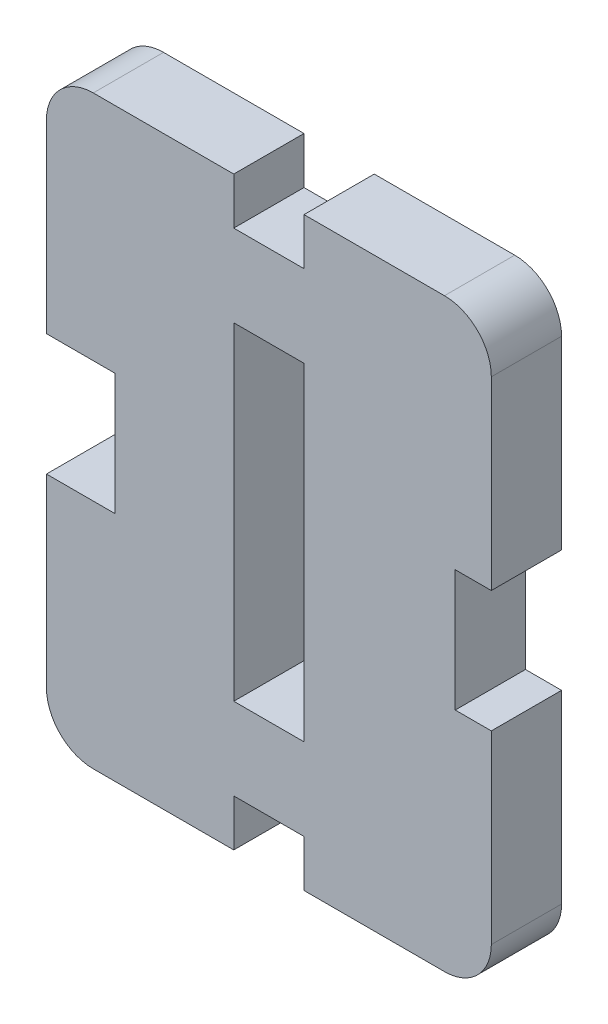
ISO-10303-21;
HEADER;
FILE_DESCRIPTION(('STEP AP214'),'2;1');
FILE_NAME('part.step','',(''),(''),'','','');
FILE_SCHEMA(('AUTOMOTIVE_DESIGN { 1 0 10303 214 1 1 1 1 }'));
ENDSEC;
DATA;
#1=APPLICATION_CONTEXT('core data for automotive mechanical design processes');
#2=APPLICATION_PROTOCOL_DEFINITION('international standard','automotive_design',2000,#1);
#3=PRODUCT_CONTEXT('',#1,'mechanical');
#4=PRODUCT('Part','Part','',(#3));
#5=PRODUCT_RELATED_PRODUCT_CATEGORY('part','',(#4));
#6=PRODUCT_DEFINITION_FORMATION('','',#4);
#7=PRODUCT_DEFINITION_CONTEXT('part definition',#1,'design');
#8=PRODUCT_DEFINITION('design','',#6,#7);
#9=PRODUCT_DEFINITION_SHAPE('','',#8);
#10=(LENGTH_UNIT() NAMED_UNIT(*) SI_UNIT(.MILLI.,.METRE.));
#11=(NAMED_UNIT(*) PLANE_ANGLE_UNIT() SI_UNIT($,.RADIAN.));
#12=(NAMED_UNIT(*) SI_UNIT($,.STERADIAN.) SOLID_ANGLE_UNIT());
#13=UNCERTAINTY_MEASURE_WITH_UNIT(LENGTH_MEASURE(1.E-05),#10,'distance_accuracy_value','');
#14=(GEOMETRIC_REPRESENTATION_CONTEXT(3) GLOBAL_UNCERTAINTY_ASSIGNED_CONTEXT((#13)) GLOBAL_UNIT_ASSIGNED_CONTEXT((#10,
#11,#12)) REPRESENTATION_CONTEXT('',''));
#15=CARTESIAN_POINT('',(0.,0.,0.));
#16=DIRECTION('',(0.,0.,1.));
#17=DIRECTION('',(1.,0.,0.));
#18=AXIS2_PLACEMENT_3D('',#15,#16,#17);
#19=CARTESIAN_POINT('',(-1050.11691061095,53.9977448376046,3.00000000000077));
#20=DIRECTION('',(0.,0.,-1.));
#21=DIRECTION('',(-1.,0.,0.));
#22=AXIS2_PLACEMENT_3D('',#19,#20,#21);
#23=PLANE('',#22);
#24=CARTESIAN_POINT('',(-1050.11691061095,53.9977448376046,3.00000000000077));
#25=DIRECTION('',(0.,0.,1.));
#26=DIRECTION('',(-1.,0.,0.));
#27=AXIS2_PLACEMENT_3D('',#24,#25,#26);
#28=CIRCLE('',#27,2.);
#29=CARTESIAN_POINT('',(-1050.11691061095,55.9977448376048,3.00000000000078));
#30=VERTEX_POINT('',#29);
#31=CARTESIAN_POINT('',(-1052.11691061095,53.9977448376047,3.00000000000077));
#32=VERTEX_POINT('',#31);
#33=EDGE_CURVE('E303',#30,#32,#28,.T.);
#34=ORIENTED_EDGE('',*,*,#33,.T.);
#35=DIRECTION('',(0.,-1.,0.));
#36=VECTOR('',#35,1.);
#37=CARTESIAN_POINT('',(-1052.11691061095,46.0930739118321,3.00000000000068));
#38=LINE('',#37,#36);
#39=CARTESIAN_POINT('',(-1052.11691061095,46.0930739118321,3.00000000000068));
#40=VERTEX_POINT('',#39);
#41=EDGE_CURVE('E306',#32,#40,#38,.T.);
#42=ORIENTED_EDGE('',*,*,#41,.T.);
#43=DIRECTION('',(1.,0.,0.));
#44=VECTOR('',#43,1.);
#45=CARTESIAN_POINT('',(-1049.19041833405,46.0930739118321,3.00000000000061));
#46=LINE('',#45,#44);
#47=CARTESIAN_POINT('',(-1049.19041833405,46.0930739118321,3.00000000000061));
#48=VERTEX_POINT('',#47);
#49=EDGE_CURVE('E308',#40,#48,#46,.T.);
#50=ORIENTED_EDGE('',*,*,#49,.T.);
#51=DIRECTION('',(0.,-1.,0.));
#52=VECTOR('',#51,1.);
#53=CARTESIAN_POINT('',(-1049.19041833405,40.9024157633773,3.00000000000059));
#54=LINE('',#53,#52);
#55=CARTESIAN_POINT('',(-1049.19041833405,40.9024157633773,3.00000000000059));
#56=VERTEX_POINT('',#55);
#57=EDGE_CURVE('E310',#48,#56,#54,.T.);
#58=ORIENTED_EDGE('',*,*,#57,.T.);
#59=DIRECTION('',(-1.,0.,0.));
#60=VECTOR('',#59,1.);
#61=CARTESIAN_POINT('',(-1049.19041833405,40.9024157633773,3.00000000000059));
#62=LINE('',#61,#60);
#63=CARTESIAN_POINT('',(-1052.11691061095,40.9024157633774,3.00000000000086));
#64=VERTEX_POINT('',#63);
#65=EDGE_CURVE('E312',#56,#64,#62,.T.);
#66=ORIENTED_EDGE('',*,*,#65,.T.);
#67=DIRECTION('',(0.,-1.,0.));
#68=VECTOR('',#67,1.);
#69=CARTESIAN_POINT('',(-1052.11691061095,40.9024157633774,3.00000000000086));
#70=LINE('',#69,#68);
#71=CARTESIAN_POINT('',(-1052.11691061095,32.9977448376047,3.00000000000082));
#72=VERTEX_POINT('',#71);
#73=EDGE_CURVE('E314',#64,#72,#70,.T.);
#74=ORIENTED_EDGE('',*,*,#73,.T.);
#75=CARTESIAN_POINT('',(-1050.11691061095,32.9977448376047,3.00000000000068));
#76=DIRECTION('',(0.,0.,1.));
#77=DIRECTION('',(1.,0.,0.));
#78=AXIS2_PLACEMENT_3D('',#75,#76,#77);
#79=CIRCLE('',#78,2.00000000000011);
#80=CARTESIAN_POINT('',(-1050.11691061095,30.9977448376045,3.00000000000071));
#81=VERTEX_POINT('',#80);
#82=EDGE_CURVE('E316',#72,#81,#79,.T.);
#83=ORIENTED_EDGE('',*,*,#82,.T.);
#84=DIRECTION('',(1.,0.,0.));
#85=VECTOR('',#84,1.);
#86=CARTESIAN_POINT('',(-1050.11691061095,30.9977448376048,3.00000000000075));
#87=LINE('',#86,#85);
#88=CARTESIAN_POINT('',(-1044.11691061095,30.9977448376048,3.00000000000071));
#89=VERTEX_POINT('',#88);
#90=EDGE_CURVE('E318',#81,#89,#87,.T.);
#91=ORIENTED_EDGE('',*,*,#90,.T.);
#92=DIRECTION('',(0.,1.,0.));
#93=VECTOR('',#92,1.);
#94=CARTESIAN_POINT('',(-1044.11691061095,32.9977448376049,3.00000000000077));
#95=LINE('',#94,#93);
#96=CARTESIAN_POINT('',(-1044.11691061095,32.9977448376049,3.00000000000077));
#97=VERTEX_POINT('',#96);
#98=EDGE_CURVE('E320',#89,#97,#95,.T.);
#99=ORIENTED_EDGE('',*,*,#98,.T.);
#100=DIRECTION('',(1.,0.,0.));
#101=VECTOR('',#100,1.);
#102=CARTESIAN_POINT('',(-1042.61691061095,32.9977448376047,3.00000000000068));
#103=LINE('',#102,#101);
#104=CARTESIAN_POINT('',(-1041.11691061095,32.9977448376046,3.00000000000078));
#105=VERTEX_POINT('',#104);
#106=EDGE_CURVE('E322',#97,#105,#103,.T.);
#107=ORIENTED_EDGE('',*,*,#106,.T.);
#108=DIRECTION('',(0.,-1.,0.));
#109=VECTOR('',#108,1.);
#110=CARTESIAN_POINT('',(-1041.11691061095,32.9977448376046,3.00000000000078));
#111=LINE('',#110,#109);
#112=CARTESIAN_POINT('',(-1041.11691061095,30.9977448376046,3.00000000000064));
#113=VERTEX_POINT('',#112);
#114=EDGE_CURVE('E324',#105,#113,#111,.T.);
#115=ORIENTED_EDGE('',*,*,#114,.T.);
#116=DIRECTION('',(1.,0.,0.));
#117=VECTOR('',#116,1.);
#118=CARTESIAN_POINT('',(-1041.11691061095,30.9977448376046,3.00000000000064));
#119=LINE('',#118,#117);
#120=CARTESIAN_POINT('',(-1035.11691061095,30.9977448376045,3.00000000000067));
#121=VERTEX_POINT('',#120);
#122=EDGE_CURVE('E326',#113,#121,#119,.T.);
#123=ORIENTED_EDGE('',*,*,#122,.T.);
#124=CARTESIAN_POINT('',(-1035.11691061095,32.9977448376044,3.00000000000064));
#125=DIRECTION('',(0.,0.,1.));
#126=DIRECTION('',(-1.,0.,0.));
#127=AXIS2_PLACEMENT_3D('',#124,#125,#126);
#128=CIRCLE('',#127,2.);
#129=CARTESIAN_POINT('',(-1033.11691061095,32.9977448376046,3.0000000000009));
#130=VERTEX_POINT('',#129);
#131=EDGE_CURVE('E328',#121,#130,#128,.T.);
#132=ORIENTED_EDGE('',*,*,#131,.T.);
#133=DIRECTION('',(0.,1.,0.));
#134=VECTOR('',#133,1.);
#135=CARTESIAN_POINT('',(-1033.11691061095,32.9977448376046,3.0000000000009));
#136=LINE('',#135,#134);
#137=CARTESIAN_POINT('',(-1033.11691061095,40.9024157633772,3.00000000000089));
#138=VERTEX_POINT('',#137);
#139=EDGE_CURVE('E330',#130,#138,#136,.T.);
#140=ORIENTED_EDGE('',*,*,#139,.T.);
#141=DIRECTION('',(-1.,0.,0.));
#142=VECTOR('',#141,1.);
#143=CARTESIAN_POINT('',(-1033.11691061095,40.9024157633772,3.00000000000089));
#144=LINE('',#143,#142);
#145=CARTESIAN_POINT('',(-1034.65769352971,40.9024157633771,3.00000000000063));
#146=VERTEX_POINT('',#145);
#147=EDGE_CURVE('E332',#138,#146,#144,.T.);
#148=ORIENTED_EDGE('',*,*,#147,.T.);
#149=DIRECTION('',(0.,1.,0.));
#150=VECTOR('',#149,1.);
#151=CARTESIAN_POINT('',(-1034.65769352971,46.093073911832,3.00000000000057));
#152=LINE('',#151,#150);
#153=CARTESIAN_POINT('',(-1034.65769352971,46.093073911832,3.00000000000057));
#154=VERTEX_POINT('',#153);
#155=EDGE_CURVE('E334',#146,#154,#152,.T.);
#156=ORIENTED_EDGE('',*,*,#155,.T.);
#157=DIRECTION('',(1.,0.,0.));
#158=VECTOR('',#157,1.);
#159=CARTESIAN_POINT('',(-1033.11691061095,46.0930739118321,3.00000000000072));
#160=LINE('',#159,#158);
#161=CARTESIAN_POINT('',(-1033.11691061095,46.0930739118321,3.00000000000072));
#162=VERTEX_POINT('',#161);
#163=EDGE_CURVE('E336',#154,#162,#160,.T.);
#164=ORIENTED_EDGE('',*,*,#163,.T.);
#165=DIRECTION('',(0.,1.,0.));
#166=VECTOR('',#165,1.);
#167=CARTESIAN_POINT('',(-1033.11691061095,53.9977448376047,3.00000000000086));
#168=LINE('',#167,#166);
#169=CARTESIAN_POINT('',(-1033.11691061095,53.9977448376047,3.00000000000086));
#170=VERTEX_POINT('',#169);
#171=EDGE_CURVE('E338',#162,#170,#168,.T.);
#172=ORIENTED_EDGE('',*,*,#171,.T.);
#173=CARTESIAN_POINT('',(-1035.11691061095,53.9977448376046,3.00000000000071));
#174=DIRECTION('',(0.,0.,1.));
#175=DIRECTION('',(1.,0.,0.));
#176=AXIS2_PLACEMENT_3D('',#173,#174,#175);
#177=CIRCLE('',#176,2.);
#178=CARTESIAN_POINT('',(-1035.11691061095,55.9977448376046,3.00000000000066));
#179=VERTEX_POINT('',#178);
#180=EDGE_CURVE('E340',#170,#179,#177,.T.);
#181=ORIENTED_EDGE('',*,*,#180,.T.);
#182=DIRECTION('',(-1.,0.,0.));
#183=VECTOR('',#182,1.);
#184=CARTESIAN_POINT('',(-1041.11691061095,55.9977448376046,3.00000000000071));
#185=LINE('',#184,#183);
#186=CARTESIAN_POINT('',(-1041.11691061095,55.9977448376046,3.00000000000071));
#187=VERTEX_POINT('',#186);
#188=EDGE_CURVE('E342',#179,#187,#185,.T.);
#189=ORIENTED_EDGE('',*,*,#188,.T.);
#190=DIRECTION('',(0.,-1.,0.));
#191=VECTOR('',#190,1.);
#192=CARTESIAN_POINT('',(-1041.11691061095,53.9977448376047,3.00000000000082));
#193=LINE('',#192,#191);
#194=CARTESIAN_POINT('',(-1041.11691061095,53.9977448376047,3.00000000000082));
#195=VERTEX_POINT('',#194);
#196=EDGE_CURVE('E344',#187,#195,#193,.T.);
#197=ORIENTED_EDGE('',*,*,#196,.T.);
#198=DIRECTION('',(-1.,0.,0.));
#199=VECTOR('',#198,1.);
#200=CARTESIAN_POINT('',(-1042.61691061095,53.9977448376047,3.00000000000063));
#201=LINE('',#200,#199);
#202=CARTESIAN_POINT('',(-1044.11691061095,53.997744837605,3.00000000000077));
#203=VERTEX_POINT('',#202);
#204=EDGE_CURVE('E346',#195,#203,#201,.T.);
#205=ORIENTED_EDGE('',*,*,#204,.T.);
#206=DIRECTION('',(0.,1.,0.));
#207=VECTOR('',#206,1.);
#208=CARTESIAN_POINT('',(-1044.11691061095,53.997744837605,3.00000000000077));
#209=LINE('',#208,#207);
#210=CARTESIAN_POINT('',(-1044.11691061095,55.9977448376049,3.00000000000074));
#211=VERTEX_POINT('',#210);
#212=EDGE_CURVE('E348',#203,#211,#209,.T.);
#213=ORIENTED_EDGE('',*,*,#212,.T.);
#214=DIRECTION('',(-1.,0.,0.));
#215=VECTOR('',#214,1.);
#216=CARTESIAN_POINT('',(-1050.11691061095,55.9977448376048,3.00000000000078));
#217=LINE('',#216,#215);
#218=EDGE_CURVE('E350',#211,#30,#217,.T.);
#219=ORIENTED_EDGE('',*,*,#218,.T.);
#220=EDGE_LOOP('',(#34,#42,#50,#58,#66,#74,#83,#91,#99,#107,#115,#123,#132,#140,#148,#156,#164,
#172,#181,#189,#197,#205,#213,#219));
#221=FACE_BOUND('',#220,.T.);
#222=DIRECTION('',(-1.,0.,0.));
#223=VECTOR('',#222,1.);
#224=CARTESIAN_POINT('',(-1041.11691061095,50.4977448376046,3.00000000000084));
#225=LINE('',#224,#223);
#226=CARTESIAN_POINT('',(-1041.11691061095,50.4977448376046,3.00000000000084));
#227=VERTEX_POINT('',#226);
#228=CARTESIAN_POINT('',(-1044.11691061095,50.4977448376048,3.00000000000074));
#229=VERTEX_POINT('',#228);
#230=EDGE_CURVE('E232',#227,#229,#225,.T.);
#231=ORIENTED_EDGE('',*,*,#230,.F.);
#232=DIRECTION('',(0.,1.,0.));
#233=VECTOR('',#232,1.);
#234=CARTESIAN_POINT('',(-1041.11691061095,36.4977448376045,3.00000000000074));
#235=LINE('',#234,#233);
#236=CARTESIAN_POINT('',(-1041.11691061095,36.4977448376045,3.00000000000074));
#237=VERTEX_POINT('',#236);
#238=EDGE_CURVE('E247',#237,#227,#235,.T.);
#239=ORIENTED_EDGE('',*,*,#238,.F.);
#240=DIRECTION('',(1.,0.,0.));
#241=VECTOR('',#240,1.);
#242=CARTESIAN_POINT('',(-1041.11691061095,36.4977448376045,3.00000000000074));
#243=LINE('',#242,#241);
#244=CARTESIAN_POINT('',(-1044.11691061095,36.4977448376048,3.00000000000079));
#245=VERTEX_POINT('',#244);
#246=EDGE_CURVE('E245',#245,#237,#243,.T.);
#247=ORIENTED_EDGE('',*,*,#246,.F.);
#248=DIRECTION('',(0.,-1.,0.));
#249=VECTOR('',#248,1.);
#250=CARTESIAN_POINT('',(-1044.11691061095,50.4977448376048,3.00000000000074));
#251=LINE('',#250,#249);
#252=EDGE_CURVE('E243',#229,#245,#251,.T.);
#253=ORIENTED_EDGE('',*,*,#252,.F.);
#254=EDGE_LOOP('',(#231,#239,#247,#253));
#255=FACE_BOUND('',#254,.T.);
#256=ADVANCED_FACE('F32',(#221,#255),#23,.F.);
#257=CARTESIAN_POINT('',(-1050.11691061095,53.9977448376047,7.63278329429795E-13));
#258=DIRECTION('',(0.,0.,-1.));
#259=DIRECTION('',(-1.,0.,0.));
#260=AXIS2_PLACEMENT_3D('',#257,#258,#259);
#261=PLANE('',#260);
#262=CARTESIAN_POINT('',(-1050.11691061095,53.9977448376047,7.63278329429795E-13));
#263=DIRECTION('',(0.,0.,1.));
#264=DIRECTION('',(-1.,0.,0.));
#265=AXIS2_PLACEMENT_3D('',#262,#263,#264);
#266=CIRCLE('',#265,2.);
#267=CARTESIAN_POINT('',(-1050.11691061095,55.9977448376047,6.80011602582908E-13));
#268=VERTEX_POINT('',#267);
#269=CARTESIAN_POINT('',(-1052.11691061095,53.9977448376046,7.63278329429795E-13));
#270=VERTEX_POINT('',#269);
#271=EDGE_CURVE('E233',#268,#270,#266,.T.);
#272=ORIENTED_EDGE('',*,*,#271,.F.);
#273=DIRECTION('',(-1.,0.,0.));
#274=VECTOR('',#273,1.);
#275=CARTESIAN_POINT('',(-1050.11691061095,55.9977448376047,6.80011602582908E-13));
#276=LINE('',#275,#274);
#277=CARTESIAN_POINT('',(-1044.11691061095,55.9977448376049,7.21644966006352E-13));
#278=VERTEX_POINT('',#277);
#279=EDGE_CURVE('E301',#278,#268,#276,.T.);
#280=ORIENTED_EDGE('',*,*,#279,.F.);
#281=DIRECTION('',(0.,1.,0.));
#282=VECTOR('',#281,1.);
#283=CARTESIAN_POINT('',(-1044.11691061095,53.9977448376048,6.52256026967279E-13));
#284=LINE('',#283,#282);
#285=CARTESIAN_POINT('',(-1044.11691061095,53.9977448376048,6.52256026967279E-13));
#286=VERTEX_POINT('',#285);
#287=EDGE_CURVE('E299',#286,#278,#284,.T.);
#288=ORIENTED_EDGE('',*,*,#287,.F.);
#289=DIRECTION('',(-1.,0.,0.));
#290=VECTOR('',#289,1.);
#291=CARTESIAN_POINT('',(-1042.61691061095,53.9977448376046,5.55111512312578E-13));
#292=LINE('',#291,#290);
#293=CARTESIAN_POINT('',(-1041.11691061095,53.9977448376046,5.55111512312578E-13));
#294=VERTEX_POINT('',#293);
#295=EDGE_CURVE('E297',#294,#286,#292,.T.);
#296=ORIENTED_EDGE('',*,*,#295,.F.);
#297=DIRECTION('',(0.,-1.,0.));
#298=VECTOR('',#297,1.);
#299=CARTESIAN_POINT('',(-1041.11691061095,53.9977448376046,5.55111512312578E-13));
#300=LINE('',#299,#298);
#301=CARTESIAN_POINT('',(-1041.11691061095,55.9977448376045,7.91033905045424E-13));
#302=VERTEX_POINT('',#301);
#303=EDGE_CURVE('E294',#302,#294,#300,.T.);
#304=ORIENTED_EDGE('',*,*,#303,.F.);
#305=DIRECTION('',(-1.,0.,0.));
#306=VECTOR('',#305,1.);
#307=CARTESIAN_POINT('',(-1041.11691061095,55.9977448376045,7.91033905045424E-13));
#308=LINE('',#307,#306);
#309=CARTESIAN_POINT('',(-1035.11691061095,55.9977448376044,4.71844785465692E-13));
#310=VERTEX_POINT('',#309);
#311=EDGE_CURVE('E292',#310,#302,#308,.T.);
#312=ORIENTED_EDGE('',*,*,#311,.F.);
#313=CARTESIAN_POINT('',(-1035.11691061095,53.9977448376045,5.41233724504764E-13));
#314=DIRECTION('',(0.,0.,1.));
#315=DIRECTION('',(1.,0.,0.));
#316=AXIS2_PLACEMENT_3D('',#313,#314,#315);
#317=CIRCLE('',#316,2.);
#318=CARTESIAN_POINT('',(-1033.11691061095,53.9977448376047,7.35522753814166E-13));
#319=VERTEX_POINT('',#318);
#320=EDGE_CURVE('E290',#319,#310,#317,.T.);
#321=ORIENTED_EDGE('',*,*,#320,.F.);
#322=DIRECTION('',(0.,1.,0.));
#323=VECTOR('',#322,1.);
#324=CARTESIAN_POINT('',(-1033.11691061095,53.9977448376047,7.35522753814166E-13));
#325=LINE('',#324,#323);
#326=CARTESIAN_POINT('',(-1033.11691061095,46.093073911832,8.04911692853238E-13));
#327=VERTEX_POINT('',#326);
#328=EDGE_CURVE('E288',#327,#319,#325,.T.);
#329=ORIENTED_EDGE('',*,*,#328,.F.);
#330=DIRECTION('',(1.,0.,0.));
#331=VECTOR('',#330,1.);
#332=CARTESIAN_POINT('',(-1033.11691061095,46.093073911832,8.04911692853238E-13));
#333=LINE('',#332,#331);
#334=CARTESIAN_POINT('',(-1034.65769352971,46.0930739118319,6.24500451351651E-13));
#335=VERTEX_POINT('',#334);
#336=EDGE_CURVE('E286',#335,#327,#333,.T.);
#337=ORIENTED_EDGE('',*,*,#336,.F.);
#338=DIRECTION('',(0.,1.,0.));
#339=VECTOR('',#338,1.);
#340=CARTESIAN_POINT('',(-1034.65769352971,46.0930739118319,6.24500451351651E-13));
#341=LINE('',#340,#339);
#342=CARTESIAN_POINT('',(-1034.65769352971,40.902415763377,5.41233724504764E-13));
#343=VERTEX_POINT('',#342);
#344=EDGE_CURVE('E284',#343,#335,#341,.T.);
#345=ORIENTED_EDGE('',*,*,#344,.F.);
#346=DIRECTION('',(-1.,0.,0.));
#347=VECTOR('',#346,1.);
#348=CARTESIAN_POINT('',(-1033.11691061095,40.9024157633772,7.63278329429795E-13));
#349=LINE('',#348,#347);
#350=CARTESIAN_POINT('',(-1033.11691061095,40.9024157633772,7.63278329429795E-13));
#351=VERTEX_POINT('',#350);
#352=EDGE_CURVE('E282',#351,#343,#349,.T.);
#353=ORIENTED_EDGE('',*,*,#352,.F.);
#354=DIRECTION('',(0.,1.,0.));
#355=VECTOR('',#354,1.);
#356=CARTESIAN_POINT('',(-1033.11691061095,32.9977448376046,7.35522753814166E-13));
#357=LINE('',#356,#355);
#358=CARTESIAN_POINT('',(-1033.11691061095,32.9977448376046,7.35522753814166E-13));
#359=VERTEX_POINT('',#358);
#360=EDGE_CURVE('E280',#359,#351,#357,.T.);
#361=ORIENTED_EDGE('',*,*,#360,.F.);
#362=CARTESIAN_POINT('',(-1035.11691061095,32.9977448376043,5.68989300120393E-13));
#363=DIRECTION('',(0.,0.,1.));
#364=DIRECTION('',(-1.,0.,0.));
#365=AXIS2_PLACEMENT_3D('',#362,#363,#364);
#366=CIRCLE('',#365,2.);
#367=CARTESIAN_POINT('',(-1035.11691061095,30.9977448376045,7.07767178198537E-13));
#368=VERTEX_POINT('',#367);
#369=EDGE_CURVE('E278',#368,#359,#366,.T.);
#370=ORIENTED_EDGE('',*,*,#369,.F.);
#371=DIRECTION('',(1.,0.,0.));
#372=VECTOR('',#371,1.);
#373=CARTESIAN_POINT('',(-1041.11691061095,30.9977448376046,7.21644966006352E-13));
#374=LINE('',#373,#372);
#375=CARTESIAN_POINT('',(-1041.11691061095,30.9977448376046,7.21644966006352E-13));
#376=VERTEX_POINT('',#375);
#377=EDGE_CURVE('E276',#376,#368,#374,.T.);
#378=ORIENTED_EDGE('',*,*,#377,.F.);
#379=DIRECTION('',(0.,-1.,0.));
#380=VECTOR('',#379,1.);
#381=CARTESIAN_POINT('',(-1041.11691061095,32.9977448376046,6.24500451351651E-13));
#382=LINE('',#381,#380);
#383=CARTESIAN_POINT('',(-1041.11691061095,32.9977448376046,6.24500451351651E-13));
#384=VERTEX_POINT('',#383);
#385=EDGE_CURVE('E274',#384,#376,#382,.T.);
#386=ORIENTED_EDGE('',*,*,#385,.F.);
#387=DIRECTION('',(1.,0.,0.));
#388=VECTOR('',#387,1.);
#389=CARTESIAN_POINT('',(-1042.61691061095,32.9977448376047,6.24500451351651E-13));
#390=LINE('',#389,#388);
#391=CARTESIAN_POINT('',(-1044.11691061095,32.9977448376048,6.80011602582908E-13));
#392=VERTEX_POINT('',#391);
#393=EDGE_CURVE('E272',#392,#384,#390,.T.);
#394=ORIENTED_EDGE('',*,*,#393,.F.);
#395=DIRECTION('',(0.,1.,0.));
#396=VECTOR('',#395,1.);
#397=CARTESIAN_POINT('',(-1044.11691061095,32.9977448376048,6.80011602582908E-13));
#398=LINE('',#397,#396);
#399=CARTESIAN_POINT('',(-1044.11691061095,30.9977448376049,7.07767178198537E-13));
#400=VERTEX_POINT('',#399);
#401=EDGE_CURVE('E269',#400,#392,#398,.T.);
#402=ORIENTED_EDGE('',*,*,#401,.F.);
#403=DIRECTION('',(1.,0.,0.));
#404=VECTOR('',#403,1.);
#405=CARTESIAN_POINT('',(-1050.11691061095,30.9977448376049,7.07767178198537E-13));
#406=LINE('',#405,#404);
#407=CARTESIAN_POINT('',(-1050.11691061095,30.9977448376046,6.80011602582908E-13));
#408=VERTEX_POINT('',#407);
#409=EDGE_CURVE('E267',#408,#400,#406,.T.);
#410=ORIENTED_EDGE('',*,*,#409,.F.);
#411=CARTESIAN_POINT('',(-1050.11691061095,32.9977448376047,6.80011602582908E-13));
#412=DIRECTION('',(0.,0.,1.));
#413=DIRECTION('',(1.,0.,0.));
#414=AXIS2_PLACEMENT_3D('',#411,#412,#413);
#415=CIRCLE('',#414,2.00000000000011);
#416=CARTESIAN_POINT('',(-1052.11691061095,32.9977448376046,7.35522753814166E-13));
#417=VERTEX_POINT('',#416);
#418=EDGE_CURVE('E265',#417,#408,#415,.T.);
#419=ORIENTED_EDGE('',*,*,#418,.F.);
#420=DIRECTION('',(0.,-1.,0.));
#421=VECTOR('',#420,1.);
#422=CARTESIAN_POINT('',(-1052.11691061095,40.9024157633774,7.07767178198537E-13));
#423=LINE('',#422,#421);
#424=CARTESIAN_POINT('',(-1052.11691061095,40.9024157633774,7.07767178198537E-13));
#425=VERTEX_POINT('',#424);
#426=EDGE_CURVE('E263',#425,#417,#423,.T.);
#427=ORIENTED_EDGE('',*,*,#426,.F.);
#428=DIRECTION('',(-1.,0.,0.));
#429=VECTOR('',#428,1.);
#430=CARTESIAN_POINT('',(-1049.19041833405,40.9024157633772,5.55111512312578E-13));
#431=LINE('',#430,#429);
#432=CARTESIAN_POINT('',(-1049.19041833405,40.9024157633772,5.55111512312578E-13));
#433=VERTEX_POINT('',#432);
#434=EDGE_CURVE('E261',#433,#425,#431,.T.);
#435=ORIENTED_EDGE('',*,*,#434,.F.);
#436=DIRECTION('',(0.,-1.,0.));
#437=VECTOR('',#436,1.);
#438=CARTESIAN_POINT('',(-1049.19041833405,40.9024157633772,5.55111512312578E-13));
#439=LINE('',#438,#437);
#440=CARTESIAN_POINT('',(-1049.19041833405,46.0930739118321,5.41233724504764E-13));
#441=VERTEX_POINT('',#440);
#442=EDGE_CURVE('E259',#441,#433,#439,.T.);
#443=ORIENTED_EDGE('',*,*,#442,.F.);
#444=DIRECTION('',(1.,0.,0.));
#445=VECTOR('',#444,1.);
#446=CARTESIAN_POINT('',(-1049.19041833405,46.0930739118321,5.41233724504764E-13));
#447=LINE('',#446,#445);
#448=CARTESIAN_POINT('',(-1052.11691061095,46.0930739118321,8.18789480661053E-13));
#449=VERTEX_POINT('',#448);
#450=EDGE_CURVE('E257',#449,#441,#447,.T.);
#451=ORIENTED_EDGE('',*,*,#450,.F.);
#452=DIRECTION('',(0.,-1.,0.));
#453=VECTOR('',#452,1.);
#454=CARTESIAN_POINT('',(-1052.11691061095,46.0930739118321,8.18789480661053E-13));
#455=LINE('',#454,#453);
#456=EDGE_CURVE('E255',#270,#449,#455,.T.);
#457=ORIENTED_EDGE('',*,*,#456,.F.);
#458=EDGE_LOOP('',(#272,#280,#288,#296,#304,#312,#321,#329,#337,#345,#353,#361,#370,#378,#386,
#394,#402,#410,#419,#427,#435,#443,#451,#457));
#459=FACE_BOUND('',#458,.T.);
#460=DIRECTION('',(0.,1.,0.));
#461=VECTOR('',#460,1.);
#462=CARTESIAN_POINT('',(-1041.11691061095,36.4977448376047,7.7715611723761E-13));
#463=LINE('',#462,#461);
#464=CARTESIAN_POINT('',(-1041.11691061095,36.4977448376047,7.7715611723761E-13));
#465=VERTEX_POINT('',#464);
#466=CARTESIAN_POINT('',(-1041.11691061095,50.4977448376046,7.63278329429795E-13));
#467=VERTEX_POINT('',#466);
#468=EDGE_CURVE('E237',#465,#467,#463,.T.);
#469=ORIENTED_EDGE('',*,*,#468,.T.);
#470=DIRECTION('',(-1.,0.,0.));
#471=VECTOR('',#470,1.);
#472=CARTESIAN_POINT('',(-1041.11691061095,50.4977448376046,7.63278329429795E-13));
#473=LINE('',#472,#471);
#474=CARTESIAN_POINT('',(-1044.11691061095,50.4977448376047,7.21644966006352E-13));
#475=VERTEX_POINT('',#474);
#476=EDGE_CURVE('E55',#467,#475,#473,.T.);
#477=ORIENTED_EDGE('',*,*,#476,.T.);
#478=DIRECTION('',(0.,-1.,0.));
#479=VECTOR('',#478,1.);
#480=CARTESIAN_POINT('',(-1044.11691061095,50.4977448376047,7.21644966006352E-13));
#481=LINE('',#480,#479);
#482=CARTESIAN_POINT('',(-1044.11691061095,36.4977448376047,7.63278329429795E-13));
#483=VERTEX_POINT('',#482);
#484=EDGE_CURVE('E219',#475,#483,#481,.T.);
#485=ORIENTED_EDGE('',*,*,#484,.T.);
#486=DIRECTION('',(1.,0.,0.));
#487=VECTOR('',#486,1.);
#488=CARTESIAN_POINT('',(-1041.11691061095,36.4977448376047,7.7715611723761E-13));
#489=LINE('',#488,#487);
#490=EDGE_CURVE('E228',#483,#465,#489,.T.);
#491=ORIENTED_EDGE('',*,*,#490,.T.);
#492=EDGE_LOOP('',(#469,#477,#485,#491));
#493=FACE_BOUND('',#492,.T.);
#494=ADVANCED_FACE('F236',(#459,#493),#261,.T.);
#495=CARTESIAN_POINT('',(-1050.11691061095,53.9977448376046,3.00000000000077));
#496=DIRECTION('',(0.,0.,-1.));
#497=DIRECTION('',(-1.,0.,0.));
#498=AXIS2_PLACEMENT_3D('',#495,#496,#497);
#499=CYLINDRICAL_SURFACE('',#498,2.);
#500=ORIENTED_EDGE('',*,*,#271,.T.);
#501=DIRECTION('',(0.,0.,-1.));
#502=VECTOR('',#501,1.);
#503=CARTESIAN_POINT('',(-1052.11691061095,53.9977448376047,3.00000000000077));
#504=LINE('',#503,#502);
#505=EDGE_CURVE('E11',#32,#270,#504,.T.);
#506=ORIENTED_EDGE('',*,*,#505,.F.);
#507=ORIENTED_EDGE('',*,*,#33,.F.);
#508=DIRECTION('',(0.,0.,-1.));
#509=VECTOR('',#508,1.);
#510=CARTESIAN_POINT('',(-1050.11691061095,55.9977448376048,3.00000000000078));
#511=LINE('',#510,#509);
#512=EDGE_CURVE('E352',#30,#268,#511,.T.);
#513=ORIENTED_EDGE('',*,*,#512,.T.);
#514=EDGE_LOOP('',(#500,#506,#507,#513));
#515=FACE_BOUND('',#514,.T.);
#516=ADVANCED_FACE('F34',(#515),#499,.T.);
#517=CARTESIAN_POINT('',(-1052.11691061095,46.0930739118321,3.00000000000068));
#518=DIRECTION('',(1.,0.,0.));
#519=DIRECTION('',(0.,1.,0.));
#520=AXIS2_PLACEMENT_3D('',#517,#518,#519);
#521=PLANE('',#520);
#522=ORIENTED_EDGE('',*,*,#456,.T.);
#523=DIRECTION('',(0.,0.,-1.));
#524=VECTOR('',#523,1.);
#525=CARTESIAN_POINT('',(-1052.11691061095,46.0930739118321,3.00000000000068));
#526=LINE('',#525,#524);
#527=EDGE_CURVE('E40',#40,#449,#526,.T.);
#528=ORIENTED_EDGE('',*,*,#527,.F.);
#529=ORIENTED_EDGE('',*,*,#41,.F.);
#530=ORIENTED_EDGE('',*,*,#505,.T.);
#531=EDGE_LOOP('',(#522,#528,#529,#530));
#532=FACE_BOUND('',#531,.T.);
#533=ADVANCED_FACE('F444',(#532),#521,.F.);
#534=CARTESIAN_POINT('',(-1049.19041833405,46.0930739118321,3.00000000000061));
#535=DIRECTION('',(0.,1.,0.));
#536=DIRECTION('',(0.,0.,1.));
#537=AXIS2_PLACEMENT_3D('',#534,#535,#536);
#538=PLANE('',#537);
#539=ORIENTED_EDGE('',*,*,#450,.T.);
#540=DIRECTION('',(0.,0.,-1.));
#541=VECTOR('',#540,1.);
#542=CARTESIAN_POINT('',(-1049.19041833405,46.0930739118321,3.00000000000061));
#543=LINE('',#542,#541);
#544=EDGE_CURVE('E415',#48,#441,#543,.T.);
#545=ORIENTED_EDGE('',*,*,#544,.F.);
#546=ORIENTED_EDGE('',*,*,#49,.F.);
#547=ORIENTED_EDGE('',*,*,#527,.T.);
#548=EDGE_LOOP('',(#539,#545,#546,#547));
#549=FACE_BOUND('',#548,.T.);
#550=ADVANCED_FACE('F422',(#549),#538,.F.);
#551=CARTESIAN_POINT('',(-1049.19041833405,40.9024157633773,3.00000000000059));
#552=DIRECTION('',(1.,0.,0.));
#553=DIRECTION('',(0.,0.,-1.));
#554=AXIS2_PLACEMENT_3D('',#551,#552,#553);
#555=PLANE('',#554);
#556=ORIENTED_EDGE('',*,*,#442,.T.);
#557=DIRECTION('',(0.,0.,-1.));
#558=VECTOR('',#557,1.);
#559=CARTESIAN_POINT('',(-1049.19041833405,40.9024157633773,3.00000000000059));
#560=LINE('',#559,#558);
#561=EDGE_CURVE('E412',#56,#433,#560,.T.);
#562=ORIENTED_EDGE('',*,*,#561,.F.);
#563=ORIENTED_EDGE('',*,*,#57,.F.);
#564=ORIENTED_EDGE('',*,*,#544,.T.);
#565=EDGE_LOOP('',(#556,#562,#563,#564));
#566=FACE_BOUND('',#565,.T.);
#567=ADVANCED_FACE('F432',(#566),#555,.F.);
#568=CARTESIAN_POINT('',(-1049.19041833405,40.9024157633773,3.00000000000059));
#569=DIRECTION('',(0.,-1.,0.));
#570=DIRECTION('',(0.,0.,-1.));
#571=AXIS2_PLACEMENT_3D('',#568,#569,#570);
#572=PLANE('',#571);
#573=ORIENTED_EDGE('',*,*,#434,.T.);
#574=DIRECTION('',(0.,0.,-1.));
#575=VECTOR('',#574,1.);
#576=CARTESIAN_POINT('',(-1052.11691061095,40.9024157633774,3.00000000000086));
#577=LINE('',#576,#575);
#578=EDGE_CURVE('E409',#64,#425,#577,.T.);
#579=ORIENTED_EDGE('',*,*,#578,.F.);
#580=ORIENTED_EDGE('',*,*,#65,.F.);
#581=ORIENTED_EDGE('',*,*,#561,.T.);
#582=EDGE_LOOP('',(#573,#579,#580,#581));
#583=FACE_BOUND('',#582,.T.);
#584=ADVANCED_FACE('F436',(#583),#572,.F.);
#585=CARTESIAN_POINT('',(-1052.11691061095,40.9024157633774,3.00000000000086));
#586=DIRECTION('',(1.,0.,0.));
#587=DIRECTION('',(0.,1.,0.));
#588=AXIS2_PLACEMENT_3D('',#585,#586,#587);
#589=PLANE('',#588);
#590=ORIENTED_EDGE('',*,*,#426,.T.);
#591=DIRECTION('',(0.,0.,-1.));
#592=VECTOR('',#591,1.);
#593=CARTESIAN_POINT('',(-1052.11691061095,32.9977448376047,3.00000000000082));
#594=LINE('',#593,#592);
#595=EDGE_CURVE('E406',#72,#417,#594,.T.);
#596=ORIENTED_EDGE('',*,*,#595,.F.);
#597=ORIENTED_EDGE('',*,*,#73,.F.);
#598=ORIENTED_EDGE('',*,*,#578,.T.);
#599=EDGE_LOOP('',(#590,#596,#597,#598));
#600=FACE_BOUND('',#599,.T.);
#601=ADVANCED_FACE('F535',(#600),#589,.F.);
#602=CARTESIAN_POINT('',(-1050.11691061095,32.9977448376047,3.00000000000068));
#603=DIRECTION('',(0.,0.,-1.));
#604=DIRECTION('',(-1.,0.,0.));
#605=AXIS2_PLACEMENT_3D('',#602,#603,#604);
#606=CYLINDRICAL_SURFACE('',#605,2.00000000000011);
#607=ORIENTED_EDGE('',*,*,#418,.T.);
#608=DIRECTION('',(0.,0.,-1.));
#609=VECTOR('',#608,1.);
#610=CARTESIAN_POINT('',(-1050.11691061095,30.9977448376045,3.00000000000071));
#611=LINE('',#610,#609);
#612=EDGE_CURVE('E403',#81,#408,#611,.T.);
#613=ORIENTED_EDGE('',*,*,#612,.F.);
#614=ORIENTED_EDGE('',*,*,#82,.F.);
#615=ORIENTED_EDGE('',*,*,#595,.T.);
#616=EDGE_LOOP('',(#607,#613,#614,#615));
#617=FACE_BOUND('',#616,.T.);
#618=ADVANCED_FACE('F533',(#617),#606,.T.);
#619=CARTESIAN_POINT('',(-1050.11691061095,30.9977448376048,3.00000000000075));
#620=DIRECTION('',(0.,1.,0.));
#621=DIRECTION('',(-1.,0.,0.));
#622=AXIS2_PLACEMENT_3D('',#619,#620,#621);
#623=PLANE('',#622);
#624=ORIENTED_EDGE('',*,*,#409,.T.);
#625=DIRECTION('',(0.,0.,-1.));
#626=VECTOR('',#625,1.);
#627=CARTESIAN_POINT('',(-1044.11691061095,30.9977448376048,3.00000000000071));
#628=LINE('',#627,#626);
#629=EDGE_CURVE('E400',#89,#400,#628,.T.);
#630=ORIENTED_EDGE('',*,*,#629,.F.);
#631=ORIENTED_EDGE('',*,*,#90,.F.);
#632=ORIENTED_EDGE('',*,*,#612,.T.);
#633=EDGE_LOOP('',(#624,#630,#631,#632));
#634=FACE_BOUND('',#633,.T.);
#635=ADVANCED_FACE('F530',(#634),#623,.F.);
#636=CARTESIAN_POINT('',(-1044.11691061095,32.9977448376049,3.00000000000077));
#637=DIRECTION('',(-1.,0.,0.));
#638=DIRECTION('',(0.,0.,1.));
#639=AXIS2_PLACEMENT_3D('',#636,#637,#638);
#640=PLANE('',#639);
#641=ORIENTED_EDGE('',*,*,#401,.T.);
#642=DIRECTION('',(0.,0.,-1.));
#643=VECTOR('',#642,1.);
#644=CARTESIAN_POINT('',(-1044.11691061095,32.9977448376049,3.00000000000077));
#645=LINE('',#644,#643);
#646=EDGE_CURVE('E397',#97,#392,#645,.T.);
#647=ORIENTED_EDGE('',*,*,#646,.F.);
#648=ORIENTED_EDGE('',*,*,#98,.F.);
#649=ORIENTED_EDGE('',*,*,#629,.T.);
#650=EDGE_LOOP('',(#641,#647,#648,#649));
#651=FACE_BOUND('',#650,.T.);
#652=ADVANCED_FACE('F521',(#651),#640,.F.);
#653=CARTESIAN_POINT('',(-1042.61691061095,32.9977448376047,3.00000000000068));
#654=DIRECTION('',(0.,1.,0.));
#655=DIRECTION('',(0.,0.,1.));
#656=AXIS2_PLACEMENT_3D('',#653,#654,#655);
#657=PLANE('',#656);
#658=ORIENTED_EDGE('',*,*,#393,.T.);
#659=DIRECTION('',(0.,0.,-1.));
#660=VECTOR('',#659,1.);
#661=CARTESIAN_POINT('',(-1041.11691061095,32.9977448376046,3.00000000000078));
#662=LINE('',#661,#660);
#663=EDGE_CURVE('E394',#105,#384,#662,.T.);
#664=ORIENTED_EDGE('',*,*,#663,.F.);
#665=ORIENTED_EDGE('',*,*,#106,.F.);
#666=ORIENTED_EDGE('',*,*,#646,.T.);
#667=EDGE_LOOP('',(#658,#664,#665,#666));
#668=FACE_BOUND('',#667,.T.);
#669=ADVANCED_FACE('F525',(#668),#657,.F.);
#670=CARTESIAN_POINT('',(-1041.11691061095,32.9977448376046,3.00000000000078));
#671=DIRECTION('',(1.,0.,0.));
#672=DIRECTION('',(0.,0.,-1.));
#673=AXIS2_PLACEMENT_3D('',#670,#671,#672);
#674=PLANE('',#673);
#675=ORIENTED_EDGE('',*,*,#385,.T.);
#676=DIRECTION('',(0.,0.,-1.));
#677=VECTOR('',#676,1.);
#678=CARTESIAN_POINT('',(-1041.11691061095,30.9977448376046,3.00000000000064));
#679=LINE('',#678,#677);
#680=EDGE_CURVE('E391',#113,#376,#679,.T.);
#681=ORIENTED_EDGE('',*,*,#680,.F.);
#682=ORIENTED_EDGE('',*,*,#114,.F.);
#683=ORIENTED_EDGE('',*,*,#663,.T.);
#684=EDGE_LOOP('',(#675,#681,#682,#683));
#685=FACE_BOUND('',#684,.T.);
#686=ADVANCED_FACE('F514',(#685),#674,.F.);
#687=CARTESIAN_POINT('',(-1041.11691061095,30.9977448376046,3.00000000000064));
#688=DIRECTION('',(0.,1.,0.));
#689=DIRECTION('',(-1.,0.,0.));
#690=AXIS2_PLACEMENT_3D('',#687,#688,#689);
#691=PLANE('',#690);
#692=ORIENTED_EDGE('',*,*,#377,.T.);
#693=DIRECTION('',(0.,0.,-1.));
#694=VECTOR('',#693,1.);
#695=CARTESIAN_POINT('',(-1035.11691061095,30.9977448376045,3.00000000000067));
#696=LINE('',#695,#694);
#697=EDGE_CURVE('E388',#121,#368,#696,.T.);
#698=ORIENTED_EDGE('',*,*,#697,.F.);
#699=ORIENTED_EDGE('',*,*,#122,.F.);
#700=ORIENTED_EDGE('',*,*,#680,.T.);
#701=EDGE_LOOP('',(#692,#698,#699,#700));
#702=FACE_BOUND('',#701,.T.);
#703=ADVANCED_FACE('F510',(#702),#691,.F.);
#704=CARTESIAN_POINT('',(-1035.11691061095,32.9977448376044,3.00000000000064));
#705=DIRECTION('',(0.,0.,-1.));
#706=DIRECTION('',(-1.,0.,0.));
#707=AXIS2_PLACEMENT_3D('',#704,#705,#706);
#708=CYLINDRICAL_SURFACE('',#707,2.);
#709=ORIENTED_EDGE('',*,*,#369,.T.);
#710=DIRECTION('',(0.,0.,-1.));
#711=VECTOR('',#710,1.);
#712=CARTESIAN_POINT('',(-1033.11691061095,32.9977448376046,3.0000000000009));
#713=LINE('',#712,#711);
#714=EDGE_CURVE('E385',#130,#359,#713,.T.);
#715=ORIENTED_EDGE('',*,*,#714,.F.);
#716=ORIENTED_EDGE('',*,*,#131,.F.);
#717=ORIENTED_EDGE('',*,*,#697,.T.);
#718=EDGE_LOOP('',(#709,#715,#716,#717));
#719=FACE_BOUND('',#718,.T.);
#720=ADVANCED_FACE('F505',(#719),#708,.T.);
#721=CARTESIAN_POINT('',(-1033.11691061095,32.9977448376046,3.0000000000009));
#722=DIRECTION('',(-1.,0.,0.));
#723=DIRECTION('',(0.,0.,1.));
#724=AXIS2_PLACEMENT_3D('',#721,#722,#723);
#725=PLANE('',#724);
#726=ORIENTED_EDGE('',*,*,#360,.T.);
#727=DIRECTION('',(0.,0.,-1.));
#728=VECTOR('',#727,1.);
#729=CARTESIAN_POINT('',(-1033.11691061095,40.9024157633772,3.00000000000089));
#730=LINE('',#729,#728);
#731=EDGE_CURVE('E382',#138,#351,#730,.T.);
#732=ORIENTED_EDGE('',*,*,#731,.F.);
#733=ORIENTED_EDGE('',*,*,#139,.F.);
#734=ORIENTED_EDGE('',*,*,#714,.T.);
#735=EDGE_LOOP('',(#726,#732,#733,#734));
#736=FACE_BOUND('',#735,.T.);
#737=ADVANCED_FACE('F499',(#736),#725,.F.);
#738=CARTESIAN_POINT('',(-1033.11691061095,40.9024157633772,3.00000000000089));
#739=DIRECTION('',(0.,-1.,0.));
#740=DIRECTION('',(0.,0.,-1.));
#741=AXIS2_PLACEMENT_3D('',#738,#739,#740);
#742=PLANE('',#741);
#743=ORIENTED_EDGE('',*,*,#352,.T.);
#744=DIRECTION('',(0.,0.,-1.));
#745=VECTOR('',#744,1.);
#746=CARTESIAN_POINT('',(-1034.65769352971,40.9024157633771,3.00000000000063));
#747=LINE('',#746,#745);
#748=EDGE_CURVE('E379',#146,#343,#747,.T.);
#749=ORIENTED_EDGE('',*,*,#748,.F.);
#750=ORIENTED_EDGE('',*,*,#147,.F.);
#751=ORIENTED_EDGE('',*,*,#731,.T.);
#752=EDGE_LOOP('',(#743,#749,#750,#751));
#753=FACE_BOUND('',#752,.T.);
#754=ADVANCED_FACE('F495',(#753),#742,.F.);
#755=CARTESIAN_POINT('',(-1034.65769352971,46.093073911832,3.00000000000057));
#756=DIRECTION('',(-1.,0.,0.));
#757=DIRECTION('',(0.,0.,1.));
#758=AXIS2_PLACEMENT_3D('',#755,#756,#757);
#759=PLANE('',#758);
#760=ORIENTED_EDGE('',*,*,#344,.T.);
#761=DIRECTION('',(0.,0.,-1.));
#762=VECTOR('',#761,1.);
#763=CARTESIAN_POINT('',(-1034.65769352971,46.093073911832,3.00000000000057));
#764=LINE('',#763,#762);
#765=EDGE_CURVE('E376',#154,#335,#764,.T.);
#766=ORIENTED_EDGE('',*,*,#765,.F.);
#767=ORIENTED_EDGE('',*,*,#155,.F.);
#768=ORIENTED_EDGE('',*,*,#748,.T.);
#769=EDGE_LOOP('',(#760,#766,#767,#768));
#770=FACE_BOUND('',#769,.T.);
#771=ADVANCED_FACE('F490',(#770),#759,.F.);
#772=CARTESIAN_POINT('',(-1033.11691061095,46.0930739118321,3.00000000000072));
#773=DIRECTION('',(0.,1.,0.));
#774=DIRECTION('',(0.,0.,1.));
#775=AXIS2_PLACEMENT_3D('',#772,#773,#774);
#776=PLANE('',#775);
#777=ORIENTED_EDGE('',*,*,#336,.T.);
#778=DIRECTION('',(0.,0.,-1.));
#779=VECTOR('',#778,1.);
#780=CARTESIAN_POINT('',(-1033.11691061095,46.0930739118321,3.00000000000072));
#781=LINE('',#780,#779);
#782=EDGE_CURVE('E373',#162,#327,#781,.T.);
#783=ORIENTED_EDGE('',*,*,#782,.F.);
#784=ORIENTED_EDGE('',*,*,#163,.F.);
#785=ORIENTED_EDGE('',*,*,#765,.T.);
#786=EDGE_LOOP('',(#777,#783,#784,#785));
#787=FACE_BOUND('',#786,.T.);
#788=ADVANCED_FACE('F484',(#787),#776,.F.);
#789=CARTESIAN_POINT('',(-1033.11691061095,53.9977448376047,3.00000000000086));
#790=DIRECTION('',(-1.,0.,0.));
#791=DIRECTION('',(0.,0.,1.));
#792=AXIS2_PLACEMENT_3D('',#789,#790,#791);
#793=PLANE('',#792);
#794=ORIENTED_EDGE('',*,*,#328,.T.);
#795=DIRECTION('',(0.,0.,-1.));
#796=VECTOR('',#795,1.);
#797=CARTESIAN_POINT('',(-1033.11691061095,53.9977448376047,3.00000000000086));
#798=LINE('',#797,#796);
#799=EDGE_CURVE('E370',#170,#319,#798,.T.);
#800=ORIENTED_EDGE('',*,*,#799,.F.);
#801=ORIENTED_EDGE('',*,*,#171,.F.);
#802=ORIENTED_EDGE('',*,*,#782,.T.);
#803=EDGE_LOOP('',(#794,#800,#801,#802));
#804=FACE_BOUND('',#803,.T.);
#805=ADVANCED_FACE('F480',(#804),#793,.F.);
#806=CARTESIAN_POINT('',(-1035.11691061095,53.9977448376046,3.00000000000071));
#807=DIRECTION('',(0.,0.,-1.));
#808=DIRECTION('',(-1.,0.,0.));
#809=AXIS2_PLACEMENT_3D('',#806,#807,#808);
#810=CYLINDRICAL_SURFACE('',#809,2.);
#811=ORIENTED_EDGE('',*,*,#320,.T.);
#812=DIRECTION('',(0.,0.,-1.));
#813=VECTOR('',#812,1.);
#814=CARTESIAN_POINT('',(-1035.11691061095,55.9977448376046,3.00000000000066));
#815=LINE('',#814,#813);
#816=EDGE_CURVE('E367',#179,#310,#815,.T.);
#817=ORIENTED_EDGE('',*,*,#816,.F.);
#818=ORIENTED_EDGE('',*,*,#180,.F.);
#819=ORIENTED_EDGE('',*,*,#799,.T.);
#820=EDGE_LOOP('',(#811,#817,#818,#819));
#821=FACE_BOUND('',#820,.T.);
#822=ADVANCED_FACE('F475',(#821),#810,.T.);
#823=CARTESIAN_POINT('',(-1041.11691061095,55.9977448376046,3.00000000000071));
#824=DIRECTION('',(0.,-1.,0.));
#825=DIRECTION('',(0.,0.,-1.));
#826=AXIS2_PLACEMENT_3D('',#823,#824,#825);
#827=PLANE('',#826);
#828=ORIENTED_EDGE('',*,*,#311,.T.);
#829=DIRECTION('',(0.,0.,-1.));
#830=VECTOR('',#829,1.);
#831=CARTESIAN_POINT('',(-1041.11691061095,55.9977448376046,3.00000000000071));
#832=LINE('',#831,#830);
#833=EDGE_CURVE('E364',#187,#302,#832,.T.);
#834=ORIENTED_EDGE('',*,*,#833,.F.);
#835=ORIENTED_EDGE('',*,*,#188,.F.);
#836=ORIENTED_EDGE('',*,*,#816,.T.);
#837=EDGE_LOOP('',(#828,#834,#835,#836));
#838=FACE_BOUND('',#837,.T.);
#839=ADVANCED_FACE('F469',(#838),#827,.F.);
#840=CARTESIAN_POINT('',(-1041.11691061095,53.9977448376047,3.00000000000082));
#841=DIRECTION('',(1.,0.,0.));
#842=DIRECTION('',(0.,0.,-1.));
#843=AXIS2_PLACEMENT_3D('',#840,#841,#842);
#844=PLANE('',#843);
#845=ORIENTED_EDGE('',*,*,#303,.T.);
#846=DIRECTION('',(0.,0.,-1.));
#847=VECTOR('',#846,1.);
#848=CARTESIAN_POINT('',(-1041.11691061095,53.9977448376047,3.00000000000082));
#849=LINE('',#848,#847);
#850=EDGE_CURVE('E361',#195,#294,#849,.T.);
#851=ORIENTED_EDGE('',*,*,#850,.F.);
#852=ORIENTED_EDGE('',*,*,#196,.F.);
#853=ORIENTED_EDGE('',*,*,#833,.T.);
#854=EDGE_LOOP('',(#845,#851,#852,#853));
#855=FACE_BOUND('',#854,.T.);
#856=ADVANCED_FACE('F464',(#855),#844,.F.);
#857=CARTESIAN_POINT('',(-1042.61691061095,53.9977448376047,3.00000000000063));
#858=DIRECTION('',(0.,-1.,0.));
#859=DIRECTION('',(1.,0.,0.));
#860=AXIS2_PLACEMENT_3D('',#857,#858,#859);
#861=PLANE('',#860);
#862=ORIENTED_EDGE('',*,*,#295,.T.);
#863=DIRECTION('',(0.,0.,-1.));
#864=VECTOR('',#863,1.);
#865=CARTESIAN_POINT('',(-1044.11691061095,53.997744837605,3.00000000000077));
#866=LINE('',#865,#864);
#867=EDGE_CURVE('E358',#203,#286,#866,.T.);
#868=ORIENTED_EDGE('',*,*,#867,.F.);
#869=ORIENTED_EDGE('',*,*,#204,.F.);
#870=ORIENTED_EDGE('',*,*,#850,.T.);
#871=EDGE_LOOP('',(#862,#868,#869,#870));
#872=FACE_BOUND('',#871,.T.);
#873=ADVANCED_FACE('F459',(#872),#861,.F.);
#874=CARTESIAN_POINT('',(-1044.11691061095,53.997744837605,3.00000000000077));
#875=DIRECTION('',(-1.,0.,0.));
#876=DIRECTION('',(0.,0.,1.));
#877=AXIS2_PLACEMENT_3D('',#874,#875,#876);
#878=PLANE('',#877);
#879=ORIENTED_EDGE('',*,*,#287,.T.);
#880=DIRECTION('',(0.,0.,-1.));
#881=VECTOR('',#880,1.);
#882=CARTESIAN_POINT('',(-1044.11691061095,55.9977448376049,3.00000000000074));
#883=LINE('',#882,#881);
#884=EDGE_CURVE('E355',#211,#278,#883,.T.);
#885=ORIENTED_EDGE('',*,*,#884,.F.);
#886=ORIENTED_EDGE('',*,*,#212,.F.);
#887=ORIENTED_EDGE('',*,*,#867,.T.);
#888=EDGE_LOOP('',(#879,#885,#886,#887));
#889=FACE_BOUND('',#888,.T.);
#890=ADVANCED_FACE('F455',(#889),#878,.F.);
#891=CARTESIAN_POINT('',(-1050.11691061095,55.9977448376048,3.00000000000078));
#892=DIRECTION('',(0.,-1.,0.));
#893=DIRECTION('',(0.,0.,-1.));
#894=AXIS2_PLACEMENT_3D('',#891,#892,#893);
#895=PLANE('',#894);
#896=ORIENTED_EDGE('',*,*,#279,.T.);
#897=ORIENTED_EDGE('',*,*,#512,.F.);
#898=ORIENTED_EDGE('',*,*,#218,.F.);
#899=ORIENTED_EDGE('',*,*,#884,.T.);
#900=EDGE_LOOP('',(#896,#897,#898,#899));
#901=FACE_BOUND('',#900,.T.);
#902=ADVANCED_FACE('F450',(#901),#895,.F.);
#903=CARTESIAN_POINT('',(-1041.11691061095,50.4977448376046,3.00000000000084));
#904=DIRECTION('',(0.,-1.,0.));
#905=DIRECTION('',(0.,0.,-1.));
#906=AXIS2_PLACEMENT_3D('',#903,#904,#905);
#907=PLANE('',#906);
#908=ORIENTED_EDGE('',*,*,#476,.F.);
#909=DIRECTION('',(0.,0.,-1.));
#910=VECTOR('',#909,1.);
#911=CARTESIAN_POINT('',(-1041.11691061095,50.4977448376046,3.00000000000084));
#912=LINE('',#911,#910);
#913=EDGE_CURVE('E249',#227,#467,#912,.T.);
#914=ORIENTED_EDGE('',*,*,#913,.F.);
#915=ORIENTED_EDGE('',*,*,#230,.T.);
#916=DIRECTION('',(0.,0.,-1.));
#917=VECTOR('',#916,1.);
#918=CARTESIAN_POINT('',(-1044.11691061095,50.4977448376048,3.00000000000074));
#919=LINE('',#918,#917);
#920=EDGE_CURVE('E221',#229,#475,#919,.T.);
#921=ORIENTED_EDGE('',*,*,#920,.T.);
#922=EDGE_LOOP('',(#908,#914,#915,#921));
#923=FACE_BOUND('',#922,.T.);
#924=ADVANCED_FACE('F230',(#923),#907,.T.);
#925=CARTESIAN_POINT('',(-1044.11691061095,50.4977448376048,3.00000000000074));
#926=DIRECTION('',(1.,0.,0.));
#927=DIRECTION('',(0.,0.,-1.));
#928=AXIS2_PLACEMENT_3D('',#925,#926,#927);
#929=PLANE('',#928);
#930=ORIENTED_EDGE('',*,*,#484,.F.);
#931=ORIENTED_EDGE('',*,*,#920,.F.);
#932=ORIENTED_EDGE('',*,*,#252,.T.);
#933=DIRECTION('',(0.,0.,-1.));
#934=VECTOR('',#933,1.);
#935=CARTESIAN_POINT('',(-1044.11691061095,36.4977448376048,3.00000000000079));
#936=LINE('',#935,#934);
#937=EDGE_CURVE('E224',#245,#483,#936,.T.);
#938=ORIENTED_EDGE('',*,*,#937,.T.);
#939=EDGE_LOOP('',(#930,#931,#932,#938));
#940=FACE_BOUND('',#939,.T.);
#941=ADVANCED_FACE('F220',(#940),#929,.T.);
#942=CARTESIAN_POINT('',(-1041.11691061095,36.4977448376045,3.00000000000074));
#943=DIRECTION('',(0.,1.,0.));
#944=DIRECTION('',(0.,0.,1.));
#945=AXIS2_PLACEMENT_3D('',#942,#943,#944);
#946=PLANE('',#945);
#947=ORIENTED_EDGE('',*,*,#490,.F.);
#948=ORIENTED_EDGE('',*,*,#937,.F.);
#949=ORIENTED_EDGE('',*,*,#246,.T.);
#950=DIRECTION('',(0.,0.,-1.));
#951=VECTOR('',#950,1.);
#952=CARTESIAN_POINT('',(-1041.11691061095,36.4977448376045,3.00000000000074));
#953=LINE('',#952,#951);
#954=EDGE_CURVE('E47',#237,#465,#953,.T.);
#955=ORIENTED_EDGE('',*,*,#954,.T.);
#956=EDGE_LOOP('',(#947,#948,#949,#955));
#957=FACE_BOUND('',#956,.T.);
#958=ADVANCED_FACE('F664',(#957),#946,.T.);
#959=CARTESIAN_POINT('',(-1041.11691061095,36.4977448376045,3.00000000000074));
#960=DIRECTION('',(-1.,0.,0.));
#961=DIRECTION('',(0.,0.,1.));
#962=AXIS2_PLACEMENT_3D('',#959,#960,#961);
#963=PLANE('',#962);
#964=ORIENTED_EDGE('',*,*,#468,.F.);
#965=ORIENTED_EDGE('',*,*,#954,.F.);
#966=ORIENTED_EDGE('',*,*,#238,.T.);
#967=ORIENTED_EDGE('',*,*,#913,.T.);
#968=EDGE_LOOP('',(#964,#965,#966,#967));
#969=FACE_BOUND('',#968,.T.);
#970=ADVANCED_FACE('F671',(#969),#963,.T.);
#971=CLOSED_SHELL('',(#256,#494,#516,#533,#550,#567,#584,#601,#618,#635,#652,#669,#686,#703,
#720,#737,#754,#771,#788,#805,#822,#839,#856,#873,#890,#902,#924,#941,#958,#970));
#972=MANIFOLD_SOLID_BREP('B2',#971);
#973=ADVANCED_BREP_SHAPE_REPRESENTATION('',(#18,#972),#14);
#974=SHAPE_DEFINITION_REPRESENTATION(#9,#973);
ENDSEC;
END-ISO-10303-21;
